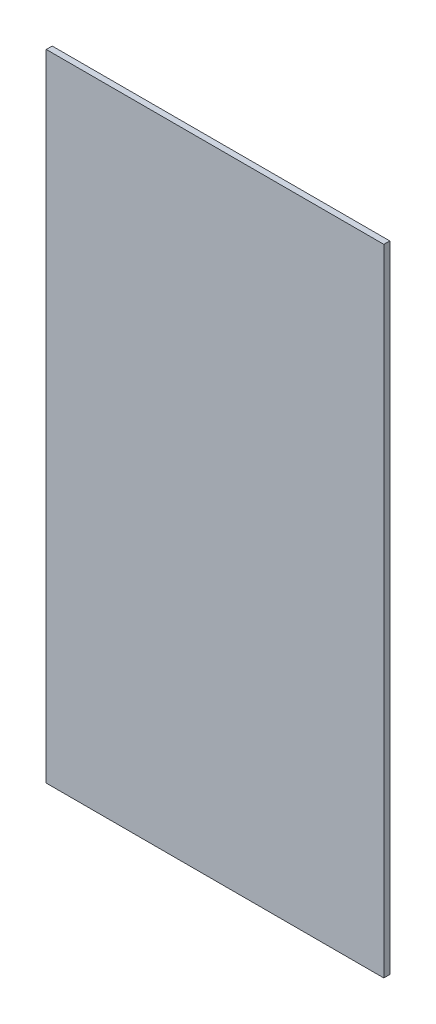
ISO-10303-21;
HEADER;
FILE_DESCRIPTION(('STEP AP214'),'2;1');
FILE_NAME('part.step','',(''),(''),'','','');
FILE_SCHEMA(('AUTOMOTIVE_DESIGN { 1 0 10303 214 1 1 1 1 }'));
ENDSEC;
DATA;
#1=APPLICATION_CONTEXT('core data for automotive mechanical design processes');
#2=APPLICATION_PROTOCOL_DEFINITION('international standard','automotive_design',2000,#1);
#3=PRODUCT_CONTEXT('',#1,'mechanical');
#4=PRODUCT('Part','Part','',(#3));
#5=PRODUCT_RELATED_PRODUCT_CATEGORY('part','',(#4));
#6=PRODUCT_DEFINITION_FORMATION('','',#4);
#7=PRODUCT_DEFINITION_CONTEXT('part definition',#1,'design');
#8=PRODUCT_DEFINITION('design','',#6,#7);
#9=PRODUCT_DEFINITION_SHAPE('','',#8);
#10=(LENGTH_UNIT() NAMED_UNIT(*) SI_UNIT(.MILLI.,.METRE.));
#11=(NAMED_UNIT(*) PLANE_ANGLE_UNIT() SI_UNIT($,.RADIAN.));
#12=(NAMED_UNIT(*) SI_UNIT($,.STERADIAN.) SOLID_ANGLE_UNIT());
#13=UNCERTAINTY_MEASURE_WITH_UNIT(LENGTH_MEASURE(1.E-05),#10,'distance_accuracy_value','');
#14=(GEOMETRIC_REPRESENTATION_CONTEXT(3) GLOBAL_UNCERTAINTY_ASSIGNED_CONTEXT((#13)) GLOBAL_UNIT_ASSIGNED_CONTEXT((#10,
#11,#12)) REPRESENTATION_CONTEXT('',''));
#15=CARTESIAN_POINT('',(0.,0.,0.));
#16=DIRECTION('',(0.,0.,1.));
#17=DIRECTION('',(1.,0.,0.));
#18=AXIS2_PLACEMENT_3D('',#15,#16,#17);
#19=CARTESIAN_POINT('',(-85.,160.,3.));
#20=DIRECTION('',(1.,0.,0.));
#21=DIRECTION('',(0.,1.,0.));
#22=AXIS2_PLACEMENT_3D('',#19,#20,#21);
#23=PLANE('',#22);
#24=DIRECTION('',(0.,-1.,0.));
#25=VECTOR('',#24,1.);
#26=CARTESIAN_POINT('',(-85.,160.,0.));
#27=LINE('',#26,#25);
#28=CARTESIAN_POINT('',(-85.,160.,0.));
#29=VERTEX_POINT('',#28);
#30=CARTESIAN_POINT('',(-85.,-160.,0.));
#31=VERTEX_POINT('',#30);
#32=EDGE_CURVE('E97',#29,#31,#27,.T.);
#33=ORIENTED_EDGE('',*,*,#32,.T.);
#34=DIRECTION('',(0.,0.,-1.));
#35=VECTOR('',#34,1.);
#36=CARTESIAN_POINT('',(-85.,-160.,3.));
#37=LINE('',#36,#35);
#38=CARTESIAN_POINT('',(-85.,-160.,3.));
#39=VERTEX_POINT('',#38);
#40=EDGE_CURVE('E11',#39,#31,#37,.T.);
#41=ORIENTED_EDGE('',*,*,#40,.F.);
#42=DIRECTION('',(0.,-1.,0.));
#43=VECTOR('',#42,1.);
#44=CARTESIAN_POINT('',(-85.,160.,3.));
#45=LINE('',#44,#43);
#46=CARTESIAN_POINT('',(-85.,160.,3.));
#47=VERTEX_POINT('',#46);
#48=EDGE_CURVE('E85',#47,#39,#45,.T.);
#49=ORIENTED_EDGE('',*,*,#48,.F.);
#50=DIRECTION('',(0.,0.,-1.));
#51=VECTOR('',#50,1.);
#52=CARTESIAN_POINT('',(-85.,160.,3.));
#53=LINE('',#52,#51);
#54=EDGE_CURVE('E93',#47,#29,#53,.T.);
#55=ORIENTED_EDGE('',*,*,#54,.T.);
#56=EDGE_LOOP('',(#33,#41,#49,#55));
#57=FACE_BOUND('',#56,.T.);
#58=ADVANCED_FACE('F34',(#57),#23,.F.);
#59=CARTESIAN_POINT('',(-85.,-160.,3.));
#60=DIRECTION('',(0.,1.,0.));
#61=DIRECTION('',(0.,0.,1.));
#62=AXIS2_PLACEMENT_3D('',#59,#60,#61);
#63=PLANE('',#62);
#64=DIRECTION('',(1.,0.,0.));
#65=VECTOR('',#64,1.);
#66=CARTESIAN_POINT('',(-85.,-160.,0.));
#67=LINE('',#66,#65);
#68=CARTESIAN_POINT('',(85.,-160.,0.));
#69=VERTEX_POINT('',#68);
#70=EDGE_CURVE('E89',#31,#69,#67,.T.);
#71=ORIENTED_EDGE('',*,*,#70,.T.);
#72=DIRECTION('',(0.,0.,-1.));
#73=VECTOR('',#72,1.);
#74=CARTESIAN_POINT('',(85.,-160.,3.));
#75=LINE('',#74,#73);
#76=CARTESIAN_POINT('',(85.,-160.,3.));
#77=VERTEX_POINT('',#76);
#78=EDGE_CURVE('E42',#77,#69,#75,.T.);
#79=ORIENTED_EDGE('',*,*,#78,.F.);
#80=DIRECTION('',(1.,0.,0.));
#81=VECTOR('',#80,1.);
#82=CARTESIAN_POINT('',(-85.,-160.,3.));
#83=LINE('',#82,#81);
#84=EDGE_CURVE('E80',#39,#77,#83,.T.);
#85=ORIENTED_EDGE('',*,*,#84,.F.);
#86=ORIENTED_EDGE('',*,*,#40,.T.);
#87=EDGE_LOOP('',(#71,#79,#85,#86));
#88=FACE_BOUND('',#87,.T.);
#89=ADVANCED_FACE('F88',(#88),#63,.F.);
#90=CARTESIAN_POINT('',(85.,160.,3.));
#91=DIRECTION('',(-1.,0.,0.));
#92=DIRECTION('',(0.,0.,1.));
#93=AXIS2_PLACEMENT_3D('',#90,#91,#92);
#94=PLANE('',#93);
#95=DIRECTION('',(0.,1.,0.));
#96=VECTOR('',#95,1.);
#97=CARTESIAN_POINT('',(85.,160.,0.));
#98=LINE('',#97,#96);
#99=CARTESIAN_POINT('',(85.,160.,0.));
#100=VERTEX_POINT('',#99);
#101=EDGE_CURVE('E67',#69,#100,#98,.T.);
#102=ORIENTED_EDGE('',*,*,#101,.T.);
#103=DIRECTION('',(0.,0.,-1.));
#104=VECTOR('',#103,1.);
#105=CARTESIAN_POINT('',(85.,160.,3.));
#106=LINE('',#105,#104);
#107=CARTESIAN_POINT('',(85.,160.,3.));
#108=VERTEX_POINT('',#107);
#109=EDGE_CURVE('E90',#108,#100,#106,.T.);
#110=ORIENTED_EDGE('',*,*,#109,.F.);
#111=DIRECTION('',(0.,1.,0.));
#112=VECTOR('',#111,1.);
#113=CARTESIAN_POINT('',(85.,160.,3.));
#114=LINE('',#113,#112);
#115=EDGE_CURVE('E83',#77,#108,#114,.T.);
#116=ORIENTED_EDGE('',*,*,#115,.F.);
#117=ORIENTED_EDGE('',*,*,#78,.T.);
#118=EDGE_LOOP('',(#102,#110,#116,#117));
#119=FACE_BOUND('',#118,.T.);
#120=ADVANCED_FACE('F91',(#119),#94,.F.);
#121=CARTESIAN_POINT('',(-85.,160.,3.));
#122=DIRECTION('',(0.,-1.,0.));
#123=DIRECTION('',(0.,0.,-1.));
#124=AXIS2_PLACEMENT_3D('',#121,#122,#123);
#125=PLANE('',#124);
#126=DIRECTION('',(-1.,0.,0.));
#127=VECTOR('',#126,1.);
#128=CARTESIAN_POINT('',(-85.,160.,0.));
#129=LINE('',#128,#127);
#130=EDGE_CURVE('E73',#100,#29,#129,.T.);
#131=ORIENTED_EDGE('',*,*,#130,.T.);
#132=ORIENTED_EDGE('',*,*,#54,.F.);
#133=DIRECTION('',(-1.,0.,0.));
#134=VECTOR('',#133,1.);
#135=CARTESIAN_POINT('',(-85.,160.,3.));
#136=LINE('',#135,#134);
#137=EDGE_CURVE('E50',#108,#47,#136,.T.);
#138=ORIENTED_EDGE('',*,*,#137,.F.);
#139=ORIENTED_EDGE('',*,*,#109,.T.);
#140=EDGE_LOOP('',(#131,#132,#138,#139));
#141=FACE_BOUND('',#140,.T.);
#142=ADVANCED_FACE('F104',(#141),#125,.F.);
#143=CARTESIAN_POINT('',(0.,0.,3.));
#144=DIRECTION('',(0.,0.,1.));
#145=DIRECTION('',(1.,0.,0.));
#146=AXIS2_PLACEMENT_3D('',#143,#144,#145);
#147=PLANE('',#146);
#148=ORIENTED_EDGE('',*,*,#48,.T.);
#149=ORIENTED_EDGE('',*,*,#84,.T.);
#150=ORIENTED_EDGE('',*,*,#115,.T.);
#151=ORIENTED_EDGE('',*,*,#137,.T.);
#152=EDGE_LOOP('',(#148,#149,#150,#151));
#153=FACE_BOUND('',#152,.T.);
#154=ADVANCED_FACE('F81',(#153),#147,.T.);
#155=CARTESIAN_POINT('',(0.,0.,0.));
#156=DIRECTION('',(0.,0.,1.));
#157=DIRECTION('',(1.,0.,0.));
#158=AXIS2_PLACEMENT_3D('',#155,#156,#157);
#159=PLANE('',#158);
#160=ORIENTED_EDGE('',*,*,#32,.F.);
#161=ORIENTED_EDGE('',*,*,#130,.F.);
#162=ORIENTED_EDGE('',*,*,#101,.F.);
#163=ORIENTED_EDGE('',*,*,#70,.F.);
#164=EDGE_LOOP('',(#160,#161,#162,#163));
#165=FACE_BOUND('',#164,.T.);
#166=ADVANCED_FACE('F107',(#165),#159,.F.);
#167=CLOSED_SHELL('',(#58,#89,#120,#142,#154,#166));
#168=MANIFOLD_SOLID_BREP('B2',#167);
#169=ADVANCED_BREP_SHAPE_REPRESENTATION('',(#18,#168),#14);
#170=SHAPE_DEFINITION_REPRESENTATION(#9,#169);
ENDSEC;
END-ISO-10303-21;
